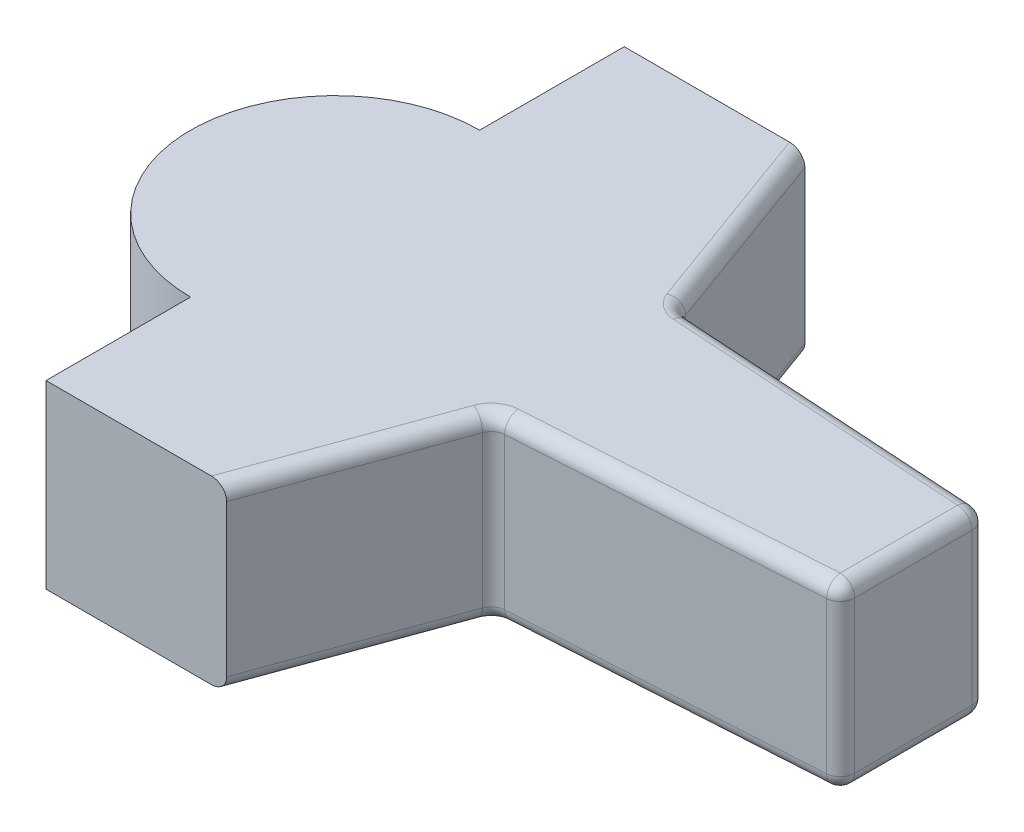
ISO-10303-21;
HEADER;
FILE_DESCRIPTION(('STEP AP214'),'2;1');
FILE_NAME('part.step','',(''),(''),'','','');
FILE_SCHEMA(('AUTOMOTIVE_DESIGN { 1 0 10303 214 1 1 1 1 }'));
ENDSEC;
DATA;
#1=APPLICATION_CONTEXT('core data for automotive mechanical design processes');
#2=APPLICATION_PROTOCOL_DEFINITION('international standard','automotive_design',2000,#1);
#3=PRODUCT_CONTEXT('',#1,'mechanical');
#4=PRODUCT('Part','Part','',(#3));
#5=PRODUCT_RELATED_PRODUCT_CATEGORY('part','',(#4));
#6=PRODUCT_DEFINITION_FORMATION('','',#4);
#7=PRODUCT_DEFINITION_CONTEXT('part definition',#1,'design');
#8=PRODUCT_DEFINITION('design','',#6,#7);
#9=PRODUCT_DEFINITION_SHAPE('','',#8);
#10=(LENGTH_UNIT() NAMED_UNIT(*) SI_UNIT(.MILLI.,.METRE.));
#11=(NAMED_UNIT(*) PLANE_ANGLE_UNIT() SI_UNIT($,.RADIAN.));
#12=(NAMED_UNIT(*) SI_UNIT($,.STERADIAN.) SOLID_ANGLE_UNIT());
#13=UNCERTAINTY_MEASURE_WITH_UNIT(LENGTH_MEASURE(1.E-05),#10,'distance_accuracy_value','');
#14=(GEOMETRIC_REPRESENTATION_CONTEXT(3) GLOBAL_UNCERTAINTY_ASSIGNED_CONTEXT((#13)) GLOBAL_UNIT_ASSIGNED_CONTEXT((#10,
#11,#12)) REPRESENTATION_CONTEXT('',''));
#15=CARTESIAN_POINT('',(0.,0.,0.));
#16=DIRECTION('',(0.,0.,1.));
#17=DIRECTION('',(1.,0.,0.));
#18=AXIS2_PLACEMENT_3D('',#15,#16,#17);
#19=CARTESIAN_POINT('',(0.,6.25,0.));
#20=DIRECTION('',(0.,-1.,0.));
#21=DIRECTION('',(0.,0.,-1.));
#22=AXIS2_PLACEMENT_3D('',#19,#20,#21);
#23=CYLINDRICAL_SURFACE('',#22,10.);
#24=CARTESIAN_POINT('',(0.,6.25,0.));
#25=DIRECTION('',(0.,1.,0.));
#26=DIRECTION('',(0.,0.,1.));
#27=AXIS2_PLACEMENT_3D('',#24,#25,#26);
#28=CIRCLE('',#27,10.);
#29=CARTESIAN_POINT('',(0.,6.25,-10.));
#30=VERTEX_POINT('',#29);
#31=CARTESIAN_POINT('',(0.,6.25,10.));
#32=VERTEX_POINT('',#31);
#33=EDGE_CURVE('E250',#30,#32,#28,.T.);
#34=ORIENTED_EDGE('',*,*,#33,.F.);
#35=DIRECTION('',(0.,-1.,0.));
#36=VECTOR('',#35,1.);
#37=CARTESIAN_POINT('',(0.,6.25,-10.));
#38=LINE('',#37,#36);
#39=CARTESIAN_POINT('',(0.,-6.25,-10.));
#40=VERTEX_POINT('',#39);
#41=EDGE_CURVE('E248',#30,#40,#38,.T.);
#42=ORIENTED_EDGE('',*,*,#41,.T.);
#43=CARTESIAN_POINT('',(0.,-6.25,0.));
#44=DIRECTION('',(0.,1.,0.));
#45=DIRECTION('',(0.,0.,1.));
#46=AXIS2_PLACEMENT_3D('',#43,#44,#45);
#47=CIRCLE('',#46,10.);
#48=CARTESIAN_POINT('',(0.,-6.25,10.));
#49=VERTEX_POINT('',#48);
#50=EDGE_CURVE('E225',#40,#49,#47,.T.);
#51=ORIENTED_EDGE('',*,*,#50,.T.);
#52=DIRECTION('',(0.,-1.,0.));
#53=VECTOR('',#52,1.);
#54=CARTESIAN_POINT('',(0.,6.25,10.));
#55=LINE('',#54,#53);
#56=EDGE_CURVE('E241',#49,#32,#55,.F.);
#57=ORIENTED_EDGE('',*,*,#56,.T.);
#58=EDGE_LOOP('',(#34,#42,#51,#57));
#59=FACE_BOUND('',#58,.T.);
#60=ADVANCED_FACE('F45',(#59),#23,.T.);
#61=CARTESIAN_POINT('',(0.,6.25,0.));
#62=DIRECTION('',(0.,1.,0.));
#63=DIRECTION('',(0.,0.,1.));
#64=AXIS2_PLACEMENT_3D('',#61,#62,#63);
#65=PLANE('',#64);
#66=DIRECTION('',(1.,0.,0.));
#67=VECTOR('',#66,1.);
#68=CARTESIAN_POINT('',(12.5,6.25,20.));
#69=LINE('',#68,#67);
#70=CARTESIAN_POINT('',(0.,6.25,20.));
#71=VERTEX_POINT('',#70);
#72=CARTESIAN_POINT('',(11.4358222275241,6.25,20.));
#73=VERTEX_POINT('',#72);
#74=EDGE_CURVE('E210',#71,#73,#69,.T.);
#75=ORIENTED_EDGE('',*,*,#74,.T.);
#76=DIRECTION('',(0.342020143325663,0.,-0.939692620785911));
#77=VECTOR('',#76,1.);
#78=CARTESIAN_POINT('',(16.5259612455731,6.25,6.01495798602529));
#79=LINE('',#78,#77);
#80=CARTESIAN_POINT('',(16.2828981983699,6.25,6.68276821971991));
#81=VERTEX_POINT('',#80);
#82=EDGE_CURVE('E343',#73,#81,#79,.T.);
#83=ORIENTED_EDGE('',*,*,#82,.T.);
#84=CARTESIAN_POINT('',(18.1622834399417,6.25,7.36680850637123));
#85=DIRECTION('',(0.,1.,0.));
#86=DIRECTION('',(0.,0.,1.));
#87=AXIS2_PLACEMENT_3D('',#84,#85,#86);
#88=CIRCLE('',#87,2.);
#89=CARTESIAN_POINT('',(18.0375268676313,6.25,5.37070334940546));
#90=VERTEX_POINT('',#89);
#91=EDGE_CURVE('E69',#81,#90,#88,.F.);
#92=ORIENTED_EDGE('',*,*,#91,.T.);
#93=DIRECTION('',(0.998052578482889,0.,-0.0623782861551805));
#94=VECTOR('',#93,1.);
#95=CARTESIAN_POINT('',(39.,6.25,4.06054877863241));
#96=LINE('',#95,#94);
#97=CARTESIAN_POINT('',(39.,6.25,4.06054877863241));
#98=VERTEX_POINT('',#97);
#99=EDGE_CURVE('E340',#90,#98,#96,.T.);
#100=ORIENTED_EDGE('',*,*,#99,.T.);
#101=DIRECTION('',(0.,0.,-1.));
#102=VECTOR('',#101,1.);
#103=CARTESIAN_POINT('',(39.,6.25,-4.06054877863241));
#104=LINE('',#103,#102);
#105=CARTESIAN_POINT('',(39.,6.25,-4.06054877863241));
#106=VERTEX_POINT('',#105);
#107=EDGE_CURVE('E338',#98,#106,#104,.T.);
#108=ORIENTED_EDGE('',*,*,#107,.T.);
#109=DIRECTION('',(-0.998052578482889,0.,-0.0623782861551805));
#110=VECTOR('',#109,1.);
#111=CARTESIAN_POINT('',(18.0375268676313,6.25,-5.37070334940546));
#112=LINE('',#111,#110);
#113=CARTESIAN_POINT('',(18.0375268676313,6.25,-5.37070334940546));
#114=VERTEX_POINT('',#113);
#115=EDGE_CURVE('E332',#106,#114,#112,.T.);
#116=ORIENTED_EDGE('',*,*,#115,.T.);
#117=CARTESIAN_POINT('',(18.1622834399417,6.25,-7.36680850637123));
#118=DIRECTION('',(0.,1.,0.));
#119=DIRECTION('',(0.,0.,1.));
#120=AXIS2_PLACEMENT_3D('',#117,#118,#119);
#121=CIRCLE('',#120,2.);
#122=CARTESIAN_POINT('',(16.2828981983699,6.25,-6.6827682197199));
#123=VERTEX_POINT('',#122);
#124=EDGE_CURVE('E334',#114,#123,#121,.F.);
#125=ORIENTED_EDGE('',*,*,#124,.T.);
#126=DIRECTION('',(-0.342020143325663,0.,-0.93969262078591));
#127=VECTOR('',#126,1.);
#128=CARTESIAN_POINT('',(16.5259612455731,6.25,-6.0149579860253));
#129=LINE('',#128,#127);
#130=CARTESIAN_POINT('',(11.4358222275241,6.25,-20.));
#131=VERTEX_POINT('',#130);
#132=EDGE_CURVE('E336',#123,#131,#129,.T.);
#133=ORIENTED_EDGE('',*,*,#132,.T.);
#134=DIRECTION('',(-1.,0.,0.));
#135=VECTOR('',#134,1.);
#136=CARTESIAN_POINT('',(0.,6.25,-20.));
#137=LINE('',#136,#135);
#138=CARTESIAN_POINT('',(0.,6.25,-20.));
#139=VERTEX_POINT('',#138);
#140=EDGE_CURVE('E231',#131,#139,#137,.T.);
#141=ORIENTED_EDGE('',*,*,#140,.T.);
#142=DIRECTION('',(0.,0.,1.));
#143=VECTOR('',#142,1.);
#144=CARTESIAN_POINT('',(0.,6.25,20.));
#145=LINE('',#144,#143);
#146=EDGE_CURVE('E217',#139,#30,#145,.T.);
#147=ORIENTED_EDGE('',*,*,#146,.T.);
#148=ORIENTED_EDGE('',*,*,#33,.T.);
#149=EDGE_CURVE('E233',#32,#71,#145,.T.);
#150=ORIENTED_EDGE('',*,*,#149,.T.);
#151=EDGE_LOOP('',(#75,#83,#92,#100,#108,#116,#125,#133,#141,#147,#148,#150));
#152=FACE_BOUND('',#151,.T.);
#153=ADVANCED_FACE('F399',(#152),#65,.T.);
#154=CARTESIAN_POINT('',(0.,-6.25,0.));
#155=DIRECTION('',(0.,1.,0.));
#156=DIRECTION('',(0.,0.,1.));
#157=AXIS2_PLACEMENT_3D('',#154,#155,#156);
#158=PLANE('',#157);
#159=CARTESIAN_POINT('',(18.1622834399417,-6.25,7.36680850637123));
#160=DIRECTION('',(0.,1.,0.));
#161=DIRECTION('',(0.,0.,1.));
#162=AXIS2_PLACEMENT_3D('',#159,#160,#161);
#163=CIRCLE('',#162,2.);
#164=CARTESIAN_POINT('',(18.0375268676313,-6.25,5.37070334940546));
#165=VERTEX_POINT('',#164);
#166=CARTESIAN_POINT('',(16.2828981983699,-6.25,6.68276821971991));
#167=VERTEX_POINT('',#166);
#168=EDGE_CURVE('E293',#165,#167,#163,.T.);
#169=ORIENTED_EDGE('',*,*,#168,.T.);
#170=DIRECTION('',(0.342020143325663,0.,-0.939692620785911));
#171=VECTOR('',#170,1.);
#172=CARTESIAN_POINT('',(11.5603073792141,-6.25,19.6579798566743));
#173=LINE('',#172,#171);
#174=CARTESIAN_POINT('',(11.4358222275241,-6.25,20.));
#175=VERTEX_POINT('',#174);
#176=EDGE_CURVE('E295',#167,#175,#173,.F.);
#177=ORIENTED_EDGE('',*,*,#176,.T.);
#178=DIRECTION('',(1.,0.,0.));
#179=VECTOR('',#178,1.);
#180=CARTESIAN_POINT('',(12.5,-6.25,20.));
#181=LINE('',#180,#179);
#182=CARTESIAN_POINT('',(0.,-6.25,20.));
#183=VERTEX_POINT('',#182);
#184=EDGE_CURVE('E226',#183,#175,#181,.T.);
#185=ORIENTED_EDGE('',*,*,#184,.F.);
#186=DIRECTION('',(0.,0.,1.));
#187=VECTOR('',#186,1.);
#188=CARTESIAN_POINT('',(0.,-6.25,20.));
#189=LINE('',#188,#187);
#190=EDGE_CURVE('E209',#49,#183,#189,.T.);
#191=ORIENTED_EDGE('',*,*,#190,.F.);
#192=ORIENTED_EDGE('',*,*,#50,.F.);
#193=CARTESIAN_POINT('',(0.,-6.25,-20.));
#194=VERTEX_POINT('',#193);
#195=EDGE_CURVE('E214',#194,#40,#189,.T.);
#196=ORIENTED_EDGE('',*,*,#195,.F.);
#197=DIRECTION('',(-1.,0.,0.));
#198=VECTOR('',#197,1.);
#199=CARTESIAN_POINT('',(0.,-6.25,-20.));
#200=LINE('',#199,#198);
#201=CARTESIAN_POINT('',(11.4358222275241,-6.25,-20.));
#202=VERTEX_POINT('',#201);
#203=EDGE_CURVE('E197',#202,#194,#200,.T.);
#204=ORIENTED_EDGE('',*,*,#203,.F.);
#205=DIRECTION('',(-0.342020143325663,0.,-0.93969262078591));
#206=VECTOR('',#205,1.);
#207=CARTESIAN_POINT('',(16.2828981983699,-6.25,-6.6827682197199));
#208=LINE('',#207,#206);
#209=CARTESIAN_POINT('',(16.2828981983699,-6.25,-6.6827682197199));
#210=VERTEX_POINT('',#209);
#211=EDGE_CURVE('E287',#202,#210,#208,.F.);
#212=ORIENTED_EDGE('',*,*,#211,.T.);
#213=CARTESIAN_POINT('',(18.1622834399417,-6.25,-7.36680850637123));
#214=DIRECTION('',(0.,1.,0.));
#215=DIRECTION('',(0.,0.,1.));
#216=AXIS2_PLACEMENT_3D('',#213,#214,#215);
#217=CIRCLE('',#216,2.);
#218=CARTESIAN_POINT('',(18.0375268676313,-6.25,-5.37070334940546));
#219=VERTEX_POINT('',#218);
#220=EDGE_CURVE('E285',#210,#219,#217,.T.);
#221=ORIENTED_EDGE('',*,*,#220,.T.);
#222=DIRECTION('',(-0.998052578482889,0.,-0.0623782861551805));
#223=VECTOR('',#222,1.);
#224=CARTESIAN_POINT('',(0.40454778388373,-6.25,-6.47276454213968));
#225=LINE('',#224,#223);
#226=CARTESIAN_POINT('',(39.,-6.25,-4.06054877863241));
#227=VERTEX_POINT('',#226);
#228=EDGE_CURVE('E283',#219,#227,#225,.F.);
#229=ORIENTED_EDGE('',*,*,#228,.T.);
#230=DIRECTION('',(0.,0.,-1.));
#231=VECTOR('',#230,1.);
#232=CARTESIAN_POINT('',(39.,-6.25,0.));
#233=LINE('',#232,#231);
#234=CARTESIAN_POINT('',(39.,-6.25,4.06054877863241));
#235=VERTEX_POINT('',#234);
#236=EDGE_CURVE('E289',#227,#235,#233,.F.);
#237=ORIENTED_EDGE('',*,*,#236,.T.);
#238=DIRECTION('',(0.998052578482889,0.,-0.0623782861551805));
#239=VECTOR('',#238,1.);
#240=CARTESIAN_POINT('',(0.40454778388373,-6.25,6.47276454213968));
#241=LINE('',#240,#239);
#242=EDGE_CURVE('E291',#235,#165,#241,.F.);
#243=ORIENTED_EDGE('',*,*,#242,.T.);
#244=EDGE_LOOP('',(#169,#177,#185,#191,#192,#196,#204,#212,#221,#229,#237,#243));
#245=FACE_BOUND('',#244,.T.);
#246=ADVANCED_FACE('F222',(#245),#158,.F.);
#247=CARTESIAN_POINT('',(0.,6.25,7.5));
#248=DIRECTION('',(-0.0623782861551805,0.,-0.998052578482889));
#249=DIRECTION('',(-0.998052578482889,0.,0.0623782861551805));
#250=AXIS2_PLACEMENT_3D('',#247,#248,#249);
#251=PLANE('',#250);
#252=DIRECTION('',(0.,-1.,0.));
#253=VECTOR('',#252,1.);
#254=CARTESIAN_POINT('',(18.0999051537865,6.25,6.36875592788834));
#255=LINE('',#254,#253);
#256=CARTESIAN_POINT('',(18.0999051537865,5.25,6.36875592788834));
#257=VERTEX_POINT('',#256);
#258=CARTESIAN_POINT('',(18.0999051537865,-5.25,6.36875592788834));
#259=VERTEX_POINT('',#258);
#260=EDGE_CURVE('E257',#257,#259,#255,.T.);
#261=ORIENTED_EDGE('',*,*,#260,.T.);
#262=DIRECTION('',(0.998052578482889,0.,-0.0623782861551805));
#263=VECTOR('',#262,1.);
#264=CARTESIAN_POINT('',(0.,-5.25,7.5));
#265=LINE('',#264,#263);
#266=CARTESIAN_POINT('',(39.0623782861552,-5.25,5.0586013571153));
#267=VERTEX_POINT('',#266);
#268=EDGE_CURVE('E307',#259,#267,#265,.T.);
#269=ORIENTED_EDGE('',*,*,#268,.T.);
#270=DIRECTION('',(0.,-1.,0.));
#271=VECTOR('',#270,1.);
#272=CARTESIAN_POINT('',(39.0623782861552,6.25,5.0586013571153));
#273=LINE('',#272,#271);
#274=CARTESIAN_POINT('',(39.0623782861552,5.25,5.0586013571153));
#275=VERTEX_POINT('',#274);
#276=EDGE_CURVE('E253',#267,#275,#273,.F.);
#277=ORIENTED_EDGE('',*,*,#276,.T.);
#278=DIRECTION('',(0.998052578482889,0.,-0.0623782861551805));
#279=VECTOR('',#278,1.);
#280=CARTESIAN_POINT('',(18.0999051537865,5.25,6.36875592788834));
#281=LINE('',#280,#279);
#282=EDGE_CURVE('E305',#275,#257,#281,.F.);
#283=ORIENTED_EDGE('',*,*,#282,.T.);
#284=EDGE_LOOP('',(#261,#269,#277,#283));
#285=FACE_BOUND('',#284,.T.);
#286=ADVANCED_FACE('F653',(#285),#251,.F.);
#287=CARTESIAN_POINT('',(40.,6.25,-5.));
#288=DIRECTION('',(-0.0623782861551805,0.,0.998052578482889));
#289=DIRECTION('',(0.998052578482889,0.,0.0623782861551805));
#290=AXIS2_PLACEMENT_3D('',#287,#288,#289);
#291=PLANE('',#290);
#292=DIRECTION('',(0.,-1.,0.));
#293=VECTOR('',#292,1.);
#294=CARTESIAN_POINT('',(39.0623782861552,6.25,-5.0586013571153));
#295=LINE('',#294,#293);
#296=CARTESIAN_POINT('',(39.0623782861552,5.25,-5.0586013571153));
#297=VERTEX_POINT('',#296);
#298=CARTESIAN_POINT('',(39.0623782861552,-5.25,-5.0586013571153));
#299=VERTEX_POINT('',#298);
#300=EDGE_CURVE('E263',#297,#299,#295,.T.);
#301=ORIENTED_EDGE('',*,*,#300,.T.);
#302=DIRECTION('',(-0.998052578482889,0.,-0.0623782861551805));
#303=VECTOR('',#302,1.);
#304=CARTESIAN_POINT('',(40.,-5.25,-5.));
#305=LINE('',#304,#303);
#306=CARTESIAN_POINT('',(18.0999051537865,-5.25,-6.36875592788834));
#307=VERTEX_POINT('',#306);
#308=EDGE_CURVE('E11',#299,#307,#305,.T.);
#309=ORIENTED_EDGE('',*,*,#308,.T.);
#310=DIRECTION('',(0.,1.,0.));
#311=VECTOR('',#310,1.);
#312=CARTESIAN_POINT('',(18.0999051537865,6.25,-6.36875592788834));
#313=LINE('',#312,#311);
#314=CARTESIAN_POINT('',(18.0999051537865,5.25,-6.36875592788834));
#315=VERTEX_POINT('',#314);
#316=EDGE_CURVE('E266',#307,#315,#313,.T.);
#317=ORIENTED_EDGE('',*,*,#316,.T.);
#318=DIRECTION('',(-0.998052578482889,0.,-0.0623782861551805));
#319=VECTOR('',#318,1.);
#320=CARTESIAN_POINT('',(39.0623782861552,5.25,-5.0586013571153));
#321=LINE('',#320,#319);
#322=EDGE_CURVE('E54',#315,#297,#321,.F.);
#323=ORIENTED_EDGE('',*,*,#322,.T.);
#324=EDGE_LOOP('',(#301,#309,#317,#323));
#325=FACE_BOUND('',#324,.T.);
#326=ADVANCED_FACE('F643',(#325),#291,.F.);
#327=CARTESIAN_POINT('',(40.,6.25,5.));
#328=DIRECTION('',(-1.,0.,0.));
#329=DIRECTION('',(0.,0.,1.));
#330=AXIS2_PLACEMENT_3D('',#327,#328,#329);
#331=PLANE('',#330);
#332=DIRECTION('',(0.,-1.,0.));
#333=VECTOR('',#332,1.);
#334=CARTESIAN_POINT('',(40.,6.25,4.06054877863241));
#335=LINE('',#334,#333);
#336=CARTESIAN_POINT('',(40.,5.25,4.06054877863241));
#337=VERTEX_POINT('',#336);
#338=CARTESIAN_POINT('',(40.,-5.25,4.06054877863241));
#339=VERTEX_POINT('',#338);
#340=EDGE_CURVE('E272',#337,#339,#335,.T.);
#341=ORIENTED_EDGE('',*,*,#340,.T.);
#342=DIRECTION('',(0.,0.,-1.));
#343=VECTOR('',#342,1.);
#344=CARTESIAN_POINT('',(40.,-5.25,5.));
#345=LINE('',#344,#343);
#346=CARTESIAN_POINT('',(40.,-5.25,-4.06054877863241));
#347=VERTEX_POINT('',#346);
#348=EDGE_CURVE('E315',#339,#347,#345,.T.);
#349=ORIENTED_EDGE('',*,*,#348,.T.);
#350=DIRECTION('',(0.,-1.,0.));
#351=VECTOR('',#350,1.);
#352=CARTESIAN_POINT('',(40.,6.25,-4.06054877863241));
#353=LINE('',#352,#351);
#354=CARTESIAN_POINT('',(40.,5.25,-4.06054877863241));
#355=VERTEX_POINT('',#354);
#356=EDGE_CURVE('E275',#347,#355,#353,.F.);
#357=ORIENTED_EDGE('',*,*,#356,.T.);
#358=DIRECTION('',(0.,0.,-1.));
#359=VECTOR('',#358,1.);
#360=CARTESIAN_POINT('',(40.,5.25,4.06054877863241));
#361=LINE('',#360,#359);
#362=EDGE_CURVE('E313',#355,#337,#361,.F.);
#363=ORIENTED_EDGE('',*,*,#362,.T.);
#364=EDGE_LOOP('',(#341,#349,#357,#363));
#365=FACE_BOUND('',#364,.T.);
#366=ADVANCED_FACE('F635',(#365),#331,.F.);
#367=CARTESIAN_POINT('',(0.,-6.25,-20.));
#368=DIRECTION('',(0.,0.,-1.));
#369=DIRECTION('',(-1.,0.,0.));
#370=AXIS2_PLACEMENT_3D('',#367,#368,#369);
#371=PLANE('',#370);
#372=DIRECTION('',(0.,1.,0.));
#373=VECTOR('',#372,1.);
#374=CARTESIAN_POINT('',(12.5,-6.25,-20.));
#375=LINE('',#374,#373);
#376=CARTESIAN_POINT('',(12.5,-5.25,-20.));
#377=VERTEX_POINT('',#376);
#378=CARTESIAN_POINT('',(12.5,5.25,-20.));
#379=VERTEX_POINT('',#378);
#380=EDGE_CURVE('E219',#377,#379,#375,.T.);
#381=ORIENTED_EDGE('',*,*,#380,.F.);
#382=CARTESIAN_POINT('',(11.4358222275241,-5.25,-20.));
#383=DIRECTION('',(0.,0.,-1.));
#384=DIRECTION('',(1.,0.,0.));
#385=AXIS2_PLACEMENT_3D('',#382,#383,#384);
#386=ELLIPSE('',#385,1.06417777247591,1.);
#387=EDGE_CURVE('E205',#377,#202,#386,.T.);
#388=ORIENTED_EDGE('',*,*,#387,.T.);
#389=ORIENTED_EDGE('',*,*,#203,.T.);
#390=DIRECTION('',(0.,1.,0.));
#391=VECTOR('',#390,1.);
#392=CARTESIAN_POINT('',(0.,-6.25,-20.));
#393=LINE('',#392,#391);
#394=EDGE_CURVE('E202',#194,#139,#393,.T.);
#395=ORIENTED_EDGE('',*,*,#394,.T.);
#396=ORIENTED_EDGE('',*,*,#140,.F.);
#397=CARTESIAN_POINT('',(11.4358222275241,5.25,-20.));
#398=DIRECTION('',(0.,0.,-1.));
#399=DIRECTION('',(-1.,0.,0.));
#400=AXIS2_PLACEMENT_3D('',#397,#398,#399);
#401=ELLIPSE('',#400,1.06417777247591,1.);
#402=EDGE_CURVE('E325',#131,#379,#401,.T.);
#403=ORIENTED_EDGE('',*,*,#402,.T.);
#404=EDGE_LOOP('',(#381,#388,#389,#395,#396,#403));
#405=FACE_BOUND('',#404,.T.);
#406=ADVANCED_FACE('F200',(#405),#371,.T.);
#407=CARTESIAN_POINT('',(12.5,-6.25,-20.));
#408=DIRECTION('',(0.93969262078591,0.,-0.342020143325663));
#409=DIRECTION('',(-0.342020143325663,0.,-0.93969262078591));
#410=AXIS2_PLACEMENT_3D('',#407,#408,#409);
#411=PLANE('',#410);
#412=DIRECTION('',(0.,1.,0.));
#413=VECTOR('',#412,1.);
#414=CARTESIAN_POINT('',(17.2225908191558,-6.25,-7.02478836304556));
#415=LINE('',#414,#413);
#416=CARTESIAN_POINT('',(17.2225908191558,5.25,-7.02478836304556));
#417=VERTEX_POINT('',#416);
#418=CARTESIAN_POINT('',(17.2225908191558,-5.25,-7.02478836304556));
#419=VERTEX_POINT('',#418);
#420=EDGE_CURVE('E269',#417,#419,#415,.F.);
#421=ORIENTED_EDGE('',*,*,#420,.T.);
#422=DIRECTION('',(-0.342020143325663,0.,-0.93969262078591));
#423=VECTOR('',#422,1.);
#424=CARTESIAN_POINT('',(12.5,-5.25,-20.));
#425=LINE('',#424,#423);
#426=EDGE_CURVE('E323',#419,#377,#425,.T.);
#427=ORIENTED_EDGE('',*,*,#426,.T.);
#428=ORIENTED_EDGE('',*,*,#380,.T.);
#429=DIRECTION('',(-0.342020143325663,0.,-0.93969262078591));
#430=VECTOR('',#429,1.);
#431=CARTESIAN_POINT('',(12.5,5.25,-20.));
#432=LINE('',#431,#430);
#433=EDGE_CURVE('E321',#379,#417,#432,.F.);
#434=ORIENTED_EDGE('',*,*,#433,.T.);
#435=EDGE_LOOP('',(#421,#427,#428,#434));
#436=FACE_BOUND('',#435,.T.);
#437=ADVANCED_FACE('F401',(#436),#411,.T.);
#438=CARTESIAN_POINT('',(0.,-6.25,20.));
#439=DIRECTION('',(-1.,0.,0.));
#440=DIRECTION('',(0.,0.,1.));
#441=AXIS2_PLACEMENT_3D('',#438,#439,#440);
#442=PLANE('',#441);
#443=ORIENTED_EDGE('',*,*,#41,.F.);
#444=ORIENTED_EDGE('',*,*,#146,.F.);
#445=ORIENTED_EDGE('',*,*,#394,.F.);
#446=ORIENTED_EDGE('',*,*,#195,.T.);
#447=EDGE_LOOP('',(#443,#444,#445,#446));
#448=FACE_BOUND('',#447,.T.);
#449=ADVANCED_FACE('F213',(#448),#442,.T.);
#450=ORIENTED_EDGE('',*,*,#56,.F.);
#451=ORIENTED_EDGE('',*,*,#190,.T.);
#452=DIRECTION('',(0.,1.,0.));
#453=VECTOR('',#452,1.);
#454=CARTESIAN_POINT('',(0.,-6.25,20.));
#455=LINE('',#454,#453);
#456=EDGE_CURVE('E218',#183,#71,#455,.T.);
#457=ORIENTED_EDGE('',*,*,#456,.T.);
#458=ORIENTED_EDGE('',*,*,#149,.F.);
#459=EDGE_LOOP('',(#450,#451,#457,#458));
#460=FACE_BOUND('',#459,.T.);
#461=ADVANCED_FACE('F466',(#460),#442,.T.);
#462=CARTESIAN_POINT('',(19.7794046853239,-6.25,0.));
#463=DIRECTION('',(0.93969262078591,0.,0.342020143325663));
#464=DIRECTION('',(0.342020143325663,0.,-0.939692620785911));
#465=AXIS2_PLACEMENT_3D('',#462,#463,#464);
#466=PLANE('',#465);
#467=DIRECTION('',(0.,1.,0.));
#468=VECTOR('',#467,1.);
#469=CARTESIAN_POINT('',(12.5,-6.25,20.));
#470=LINE('',#469,#468);
#471=CARTESIAN_POINT('',(12.5,-5.25,20.));
#472=VERTEX_POINT('',#471);
#473=CARTESIAN_POINT('',(12.5,5.25,20.));
#474=VERTEX_POINT('',#473);
#475=EDGE_CURVE('E238',#472,#474,#470,.T.);
#476=ORIENTED_EDGE('',*,*,#475,.F.);
#477=DIRECTION('',(0.342020143325663,0.,-0.939692620785911));
#478=VECTOR('',#477,1.);
#479=CARTESIAN_POINT('',(17.2225908191558,-5.25,7.02478836304557));
#480=LINE('',#479,#478);
#481=CARTESIAN_POINT('',(17.2225908191558,-5.25,7.02478836304557));
#482=VERTEX_POINT('',#481);
#483=EDGE_CURVE('E280',#472,#482,#480,.T.);
#484=ORIENTED_EDGE('',*,*,#483,.T.);
#485=DIRECTION('',(0.,-1.,0.));
#486=VECTOR('',#485,1.);
#487=CARTESIAN_POINT('',(17.2225908191558,-6.25,7.02478836304557));
#488=LINE('',#487,#486);
#489=CARTESIAN_POINT('',(17.2225908191558,5.25,7.02478836304557));
#490=VERTEX_POINT('',#489);
#491=EDGE_CURVE('E260',#482,#490,#488,.F.);
#492=ORIENTED_EDGE('',*,*,#491,.T.);
#493=DIRECTION('',(0.342020143325663,0.,-0.939692620785911));
#494=VECTOR('',#493,1.);
#495=CARTESIAN_POINT('',(19.7794046853239,5.25,0.));
#496=LINE('',#495,#494);
#497=EDGE_CURVE('E278',#490,#474,#496,.F.);
#498=ORIENTED_EDGE('',*,*,#497,.T.);
#499=EDGE_LOOP('',(#476,#484,#492,#498));
#500=FACE_BOUND('',#499,.T.);
#501=ADVANCED_FACE('F451',(#500),#466,.T.);
#502=CARTESIAN_POINT('',(12.5,-6.25,20.));
#503=DIRECTION('',(0.,0.,1.));
#504=DIRECTION('',(1.,0.,0.));
#505=AXIS2_PLACEMENT_3D('',#502,#503,#504);
#506=PLANE('',#505);
#507=ORIENTED_EDGE('',*,*,#184,.T.);
#508=CARTESIAN_POINT('',(11.4358222275241,-5.25,20.));
#509=DIRECTION('',(0.,0.,1.));
#510=DIRECTION('',(-1.,0.,0.));
#511=AXIS2_PLACEMENT_3D('',#508,#509,#510);
#512=ELLIPSE('',#511,1.06417777247591,1.);
#513=EDGE_CURVE('E299',#175,#472,#512,.T.);
#514=ORIENTED_EDGE('',*,*,#513,.T.);
#515=ORIENTED_EDGE('',*,*,#475,.T.);
#516=CARTESIAN_POINT('',(11.4358222275241,5.25,20.));
#517=DIRECTION('',(0.,0.,1.));
#518=DIRECTION('',(1.,0.,0.));
#519=AXIS2_PLACEMENT_3D('',#516,#517,#518);
#520=ELLIPSE('',#519,1.06417777247591,1.);
#521=EDGE_CURVE('E297',#474,#73,#520,.T.);
#522=ORIENTED_EDGE('',*,*,#521,.T.);
#523=ORIENTED_EDGE('',*,*,#74,.F.);
#524=ORIENTED_EDGE('',*,*,#456,.F.);
#525=EDGE_LOOP('',(#507,#514,#515,#522,#523,#524));
#526=FACE_BOUND('',#525,.T.);
#527=ADVANCED_FACE('F461',(#526),#506,.T.);
#528=CARTESIAN_POINT('',(18.1622834399417,6.25,7.36680850637123));
#529=DIRECTION('',(0.,-1.,0.));
#530=DIRECTION('',(0.,0.,-1.));
#531=AXIS2_PLACEMENT_3D('',#528,#529,#530);
#532=CYLINDRICAL_SURFACE('',#531,1.);
#533=ORIENTED_EDGE('',*,*,#491,.F.);
#534=CARTESIAN_POINT('',(18.1622834399417,-5.25,7.36680850637123));
#535=DIRECTION('',(0.,1.,0.));
#536=DIRECTION('',(0.,0.,1.));
#537=AXIS2_PLACEMENT_3D('',#534,#535,#536);
#538=CIRCLE('',#537,1.);
#539=EDGE_CURVE('E303',#482,#259,#538,.F.);
#540=ORIENTED_EDGE('',*,*,#539,.T.);
#541=ORIENTED_EDGE('',*,*,#260,.F.);
#542=CARTESIAN_POINT('',(18.1622834399417,5.25,7.36680850637123));
#543=DIRECTION('',(0.,1.,0.));
#544=DIRECTION('',(0.,0.,1.));
#545=AXIS2_PLACEMENT_3D('',#542,#543,#544);
#546=CIRCLE('',#545,1.);
#547=EDGE_CURVE('E301',#257,#490,#546,.T.);
#548=ORIENTED_EDGE('',*,*,#547,.T.);
#549=EDGE_LOOP('',(#533,#540,#541,#548));
#550=FACE_BOUND('',#549,.T.);
#551=ADVANCED_FACE('F452',(#550),#532,.F.);
#552=CARTESIAN_POINT('',(18.1622834399417,6.25,-7.36680850637123));
#553=DIRECTION('',(0.,1.,0.));
#554=DIRECTION('',(0.,0.,1.));
#555=AXIS2_PLACEMENT_3D('',#552,#553,#554);
#556=CYLINDRICAL_SURFACE('',#555,1.);
#557=ORIENTED_EDGE('',*,*,#316,.F.);
#558=CARTESIAN_POINT('',(18.1622834399417,-5.25,-7.36680850637123));
#559=DIRECTION('',(0.,1.,0.));
#560=DIRECTION('',(0.,0.,1.));
#561=AXIS2_PLACEMENT_3D('',#558,#559,#560);
#562=CIRCLE('',#561,1.);
#563=EDGE_CURVE('E330',#307,#419,#562,.F.);
#564=ORIENTED_EDGE('',*,*,#563,.T.);
#565=ORIENTED_EDGE('',*,*,#420,.F.);
#566=CARTESIAN_POINT('',(18.1622834399417,5.25,-7.36680850637123));
#567=DIRECTION('',(0.,1.,0.));
#568=DIRECTION('',(0.,0.,1.));
#569=AXIS2_PLACEMENT_3D('',#566,#567,#568);
#570=CIRCLE('',#569,1.);
#571=EDGE_CURVE('E328',#417,#315,#570,.T.);
#572=ORIENTED_EDGE('',*,*,#571,.T.);
#573=EDGE_LOOP('',(#557,#564,#565,#572));
#574=FACE_BOUND('',#573,.T.);
#575=ADVANCED_FACE('F486',(#574),#556,.F.);
#576=CARTESIAN_POINT('',(39.,6.25,-4.06054877863241));
#577=DIRECTION('',(0.,-1.,0.));
#578=DIRECTION('',(0.,0.,-1.));
#579=AXIS2_PLACEMENT_3D('',#576,#577,#578);
#580=CYLINDRICAL_SURFACE('',#579,1.);
#581=ORIENTED_EDGE('',*,*,#356,.F.);
#582=CARTESIAN_POINT('',(39.,-5.25,-4.06054877863241));
#583=DIRECTION('',(0.,-1.,0.));
#584=DIRECTION('',(0.,0.,-1.));
#585=AXIS2_PLACEMENT_3D('',#582,#583,#584);
#586=CIRCLE('',#585,1.);
#587=EDGE_CURVE('E319',#347,#299,#586,.F.);
#588=ORIENTED_EDGE('',*,*,#587,.T.);
#589=ORIENTED_EDGE('',*,*,#300,.F.);
#590=CARTESIAN_POINT('',(39.,5.25,-4.06054877863241));
#591=DIRECTION('',(0.,-1.,0.));
#592=DIRECTION('',(0.,0.,-1.));
#593=AXIS2_PLACEMENT_3D('',#590,#591,#592);
#594=CIRCLE('',#593,1.);
#595=EDGE_CURVE('E317',#297,#355,#594,.T.);
#596=ORIENTED_EDGE('',*,*,#595,.T.);
#597=EDGE_LOOP('',(#581,#588,#589,#596));
#598=FACE_BOUND('',#597,.T.);
#599=ADVANCED_FACE('F489',(#598),#580,.T.);
#600=CARTESIAN_POINT('',(39.,6.25,4.06054877863241));
#601=DIRECTION('',(0.,-1.,0.));
#602=DIRECTION('',(0.,0.,-1.));
#603=AXIS2_PLACEMENT_3D('',#600,#601,#602);
#604=CYLINDRICAL_SURFACE('',#603,1.);
#605=ORIENTED_EDGE('',*,*,#276,.F.);
#606=CARTESIAN_POINT('',(39.,-5.25,4.06054877863241));
#607=DIRECTION('',(0.,-1.,0.));
#608=DIRECTION('',(0.,0.,-1.));
#609=AXIS2_PLACEMENT_3D('',#606,#607,#608);
#610=CIRCLE('',#609,1.);
#611=EDGE_CURVE('E311',#267,#339,#610,.F.);
#612=ORIENTED_EDGE('',*,*,#611,.T.);
#613=ORIENTED_EDGE('',*,*,#340,.F.);
#614=CARTESIAN_POINT('',(39.,5.25,4.06054877863241));
#615=DIRECTION('',(0.,-1.,0.));
#616=DIRECTION('',(0.,0.,-1.));
#617=AXIS2_PLACEMENT_3D('',#614,#615,#616);
#618=CIRCLE('',#617,1.);
#619=EDGE_CURVE('E309',#337,#275,#618,.T.);
#620=ORIENTED_EDGE('',*,*,#619,.T.);
#621=EDGE_LOOP('',(#605,#612,#613,#620));
#622=FACE_BOUND('',#621,.T.);
#623=ADVANCED_FACE('F493',(#622),#604,.T.);
#624=CARTESIAN_POINT('',(11.5603073792141,-5.25,-19.6579798566743));
#625=DIRECTION('',(0.342020143325663,0.,0.93969262078591));
#626=DIRECTION('',(0.93969262078591,0.,-0.342020143325663));
#627=AXIS2_PLACEMENT_3D('',#624,#625,#626);
#628=CYLINDRICAL_SURFACE('',#627,1.);
#629=ORIENTED_EDGE('',*,*,#387,.F.);
#630=ORIENTED_EDGE('',*,*,#426,.F.);
#631=CARTESIAN_POINT('',(16.2828981983699,-5.25,-6.6827682197199));
#632=DIRECTION('',(0.342020143325663,0.,0.93969262078591));
#633=DIRECTION('',(0.939692620785911,0.,-0.342020143325663));
#634=AXIS2_PLACEMENT_3D('',#631,#632,#633);
#635=CIRCLE('',#634,1.);
#636=EDGE_CURVE('E234',#210,#419,#635,.T.);
#637=ORIENTED_EDGE('',*,*,#636,.F.);
#638=ORIENTED_EDGE('',*,*,#211,.F.);
#639=EDGE_LOOP('',(#629,#630,#637,#638));
#640=FACE_BOUND('',#639,.T.);
#641=ADVANCED_FACE('F406',(#640),#628,.T.);
#642=CARTESIAN_POINT('',(18.1622834399417,-5.25,-7.36680850637123));
#643=DIRECTION('',(0.,1.,0.));
#644=DIRECTION('',(0.,0.,1.));
#645=AXIS2_PLACEMENT_3D('',#642,#643,#644);
#646=TOROIDAL_SURFACE('',#645,2.,1.);
#647=ORIENTED_EDGE('',*,*,#636,.T.);
#648=ORIENTED_EDGE('',*,*,#563,.F.);
#649=CARTESIAN_POINT('',(18.0375268676313,-5.25,-5.37070334940546));
#650=DIRECTION('',(0.998052578482889,0.,0.0623782861551812));
#651=DIRECTION('',(0.0623782861551812,0.,-0.998052578482889));
#652=AXIS2_PLACEMENT_3D('',#649,#650,#651);
#653=CIRCLE('',#652,1.);
#654=EDGE_CURVE('E363',#219,#307,#653,.T.);
#655=ORIENTED_EDGE('',*,*,#654,.F.);
#656=ORIENTED_EDGE('',*,*,#220,.F.);
#657=EDGE_LOOP('',(#647,#648,#655,#656));
#658=FACE_BOUND('',#657,.T.);
#659=ADVANCED_FACE('F410',(#658),#646,.T.);
#660=CARTESIAN_POINT('',(39.9376217138448,-5.25,-4.00194742151711));
#661=DIRECTION('',(-0.998052578482889,0.,-0.0623782861551805));
#662=DIRECTION('',(-0.0623782861551805,0.,0.998052578482889));
#663=AXIS2_PLACEMENT_3D('',#660,#661,#662);
#664=CYLINDRICAL_SURFACE('',#663,1.);
#665=ORIENTED_EDGE('',*,*,#654,.T.);
#666=ORIENTED_EDGE('',*,*,#308,.F.);
#667=CARTESIAN_POINT('',(39.,-5.25,-4.06054877863241));
#668=DIRECTION('',(0.998052578482889,0.,0.0623782861551778));
#669=DIRECTION('',(0.0623782861551778,0.,-0.998052578482889));
#670=AXIS2_PLACEMENT_3D('',#667,#668,#669);
#671=CIRCLE('',#670,1.);
#672=EDGE_CURVE('E360',#227,#299,#671,.T.);
#673=ORIENTED_EDGE('',*,*,#672,.F.);
#674=ORIENTED_EDGE('',*,*,#228,.F.);
#675=EDGE_LOOP('',(#665,#666,#673,#674));
#676=FACE_BOUND('',#675,.T.);
#677=ADVANCED_FACE('F419',(#676),#664,.T.);
#678=CARTESIAN_POINT('',(39.,-5.25,-4.06054877863241));
#679=DIRECTION('',(0.,1.,0.));
#680=DIRECTION('',(0.,0.,1.));
#681=AXIS2_PLACEMENT_3D('',#678,#679,#680);
#682=SPHERICAL_SURFACE('',#681,1.);
#683=ORIENTED_EDGE('',*,*,#672,.T.);
#684=ORIENTED_EDGE('',*,*,#587,.F.);
#685=CARTESIAN_POINT('',(39.,-5.25,-4.06054877863241));
#686=DIRECTION('',(0.,0.,1.));
#687=DIRECTION('',(1.,0.,0.));
#688=AXIS2_PLACEMENT_3D('',#685,#686,#687);
#689=CIRCLE('',#688,1.);
#690=EDGE_CURVE('E357',#227,#347,#689,.T.);
#691=ORIENTED_EDGE('',*,*,#690,.F.);
#692=EDGE_LOOP('',(#683,#684,#691));
#693=FACE_BOUND('',#692,.T.);
#694=ADVANCED_FACE('F422',(#693),#682,.T.);
#695=CARTESIAN_POINT('',(39.,-5.25,5.));
#696=DIRECTION('',(0.,0.,-1.));
#697=DIRECTION('',(-1.,0.,0.));
#698=AXIS2_PLACEMENT_3D('',#695,#696,#697);
#699=CYLINDRICAL_SURFACE('',#698,1.);
#700=ORIENTED_EDGE('',*,*,#690,.T.);
#701=ORIENTED_EDGE('',*,*,#348,.F.);
#702=CARTESIAN_POINT('',(39.,-5.25,4.06054877863241));
#703=DIRECTION('',(0.,0.,1.));
#704=DIRECTION('',(1.,0.,0.));
#705=AXIS2_PLACEMENT_3D('',#702,#703,#704);
#706=CIRCLE('',#705,1.);
#707=EDGE_CURVE('E354',#235,#339,#706,.T.);
#708=ORIENTED_EDGE('',*,*,#707,.F.);
#709=ORIENTED_EDGE('',*,*,#236,.F.);
#710=EDGE_LOOP('',(#700,#701,#708,#709));
#711=FACE_BOUND('',#710,.T.);
#712=ADVANCED_FACE('F425',(#711),#699,.T.);
#713=CARTESIAN_POINT('',(39.,-5.25,4.06054877863241));
#714=DIRECTION('',(0.,1.,0.));
#715=DIRECTION('',(0.,0.,1.));
#716=AXIS2_PLACEMENT_3D('',#713,#714,#715);
#717=SPHERICAL_SURFACE('',#716,1.);
#718=ORIENTED_EDGE('',*,*,#707,.T.);
#719=ORIENTED_EDGE('',*,*,#611,.F.);
#720=CARTESIAN_POINT('',(39.,-5.25,4.06054877863241));
#721=DIRECTION('',(-0.998052578482888,0.,0.0623782861551847));
#722=DIRECTION('',(0.0623782861551847,0.,0.998052578482888));
#723=AXIS2_PLACEMENT_3D('',#720,#721,#722);
#724=CIRCLE('',#723,1.);
#725=EDGE_CURVE('E351',#235,#267,#724,.T.);
#726=ORIENTED_EDGE('',*,*,#725,.F.);
#727=EDGE_LOOP('',(#718,#719,#726));
#728=FACE_BOUND('',#727,.T.);
#729=ADVANCED_FACE('F430',(#728),#717,.T.);
#730=CARTESIAN_POINT('',(-0.0623782861551805,-5.25,6.50194742151711));
#731=DIRECTION('',(0.998052578482889,0.,-0.0623782861551805));
#732=DIRECTION('',(-0.0623782861551805,0.,-0.998052578482889));
#733=AXIS2_PLACEMENT_3D('',#730,#731,#732);
#734=CYLINDRICAL_SURFACE('',#733,1.);
#735=ORIENTED_EDGE('',*,*,#725,.T.);
#736=ORIENTED_EDGE('',*,*,#268,.F.);
#737=CARTESIAN_POINT('',(18.0375268676313,-5.25,5.37070334940546));
#738=DIRECTION('',(-0.998052578482889,0.,0.0623782861551812));
#739=DIRECTION('',(0.0623782861551812,0.,0.998052578482889));
#740=AXIS2_PLACEMENT_3D('',#737,#738,#739);
#741=CIRCLE('',#740,1.);
#742=EDGE_CURVE('E348',#165,#259,#741,.T.);
#743=ORIENTED_EDGE('',*,*,#742,.F.);
#744=ORIENTED_EDGE('',*,*,#242,.F.);
#745=EDGE_LOOP('',(#735,#736,#743,#744));
#746=FACE_BOUND('',#745,.T.);
#747=ADVANCED_FACE('F434',(#746),#734,.T.);
#748=CARTESIAN_POINT('',(18.1622834399417,-5.25,7.36680850637123));
#749=DIRECTION('',(0.,1.,0.));
#750=DIRECTION('',(0.,0.,1.));
#751=AXIS2_PLACEMENT_3D('',#748,#749,#750);
#752=TOROIDAL_SURFACE('',#751,2.,1.);
#753=ORIENTED_EDGE('',*,*,#742,.T.);
#754=ORIENTED_EDGE('',*,*,#539,.F.);
#755=CARTESIAN_POINT('',(16.2828981983699,-5.25,6.68276821971991));
#756=DIRECTION('',(-0.342020143325664,0.,0.93969262078591));
#757=DIRECTION('',(0.93969262078591,0.,0.342020143325664));
#758=AXIS2_PLACEMENT_3D('',#755,#756,#757);
#759=CIRCLE('',#758,1.);
#760=EDGE_CURVE('E346',#167,#482,#759,.T.);
#761=ORIENTED_EDGE('',*,*,#760,.F.);
#762=ORIENTED_EDGE('',*,*,#168,.F.);
#763=EDGE_LOOP('',(#753,#754,#761,#762));
#764=FACE_BOUND('',#763,.T.);
#765=ADVANCED_FACE('F445',(#764),#752,.T.);
#766=CARTESIAN_POINT('',(18.839712064538,-5.25,-0.342020143325663));
#767=DIRECTION('',(-0.342020143325663,0.,0.939692620785911));
#768=DIRECTION('',(0.93969262078591,0.,0.342020143325663));
#769=AXIS2_PLACEMENT_3D('',#766,#767,#768);
#770=CYLINDRICAL_SURFACE('',#769,1.);
#771=ORIENTED_EDGE('',*,*,#513,.F.);
#772=ORIENTED_EDGE('',*,*,#176,.F.);
#773=ORIENTED_EDGE('',*,*,#760,.T.);
#774=ORIENTED_EDGE('',*,*,#483,.F.);
#775=EDGE_LOOP('',(#771,#772,#773,#774));
#776=FACE_BOUND('',#775,.T.);
#777=ADVANCED_FACE('F442',(#776),#770,.T.);
#778=CARTESIAN_POINT('',(16.5259612455731,5.25,-6.0149579860253));
#779=DIRECTION('',(-0.342020143325663,0.,-0.93969262078591));
#780=DIRECTION('',(-0.93969262078591,0.,0.342020143325663));
#781=AXIS2_PLACEMENT_3D('',#778,#779,#780);
#782=CYLINDRICAL_SURFACE('',#781,1.);
#783=ORIENTED_EDGE('',*,*,#402,.F.);
#784=ORIENTED_EDGE('',*,*,#132,.F.);
#785=CARTESIAN_POINT('',(16.2828981983699,5.25,-6.6827682197199));
#786=DIRECTION('',(0.342020143325663,0.,0.93969262078591));
#787=DIRECTION('',(0.939692620785911,0.,-0.342020143325663));
#788=AXIS2_PLACEMENT_3D('',#785,#786,#787);
#789=CIRCLE('',#788,1.);
#790=EDGE_CURVE('E49',#417,#123,#789,.T.);
#791=ORIENTED_EDGE('',*,*,#790,.F.);
#792=ORIENTED_EDGE('',*,*,#433,.F.);
#793=EDGE_LOOP('',(#783,#784,#791,#792));
#794=FACE_BOUND('',#793,.T.);
#795=ADVANCED_FACE('F47',(#794),#782,.T.);
#796=CARTESIAN_POINT('',(18.1622834399417,5.25,-7.36680850637123));
#797=DIRECTION('',(0.,1.,0.));
#798=DIRECTION('',(0.,0.,1.));
#799=AXIS2_PLACEMENT_3D('',#796,#797,#798);
#800=TOROIDAL_SURFACE('',#799,2.,1.);
#801=ORIENTED_EDGE('',*,*,#790,.T.);
#802=ORIENTED_EDGE('',*,*,#124,.F.);
#803=CARTESIAN_POINT('',(18.0375268676313,5.25,-5.37070334940546));
#804=DIRECTION('',(0.998052578482889,0.,0.0623782861551812));
#805=DIRECTION('',(0.0623782861551812,0.,-0.998052578482889));
#806=AXIS2_PLACEMENT_3D('',#803,#804,#805);
#807=CIRCLE('',#806,1.);
#808=EDGE_CURVE('E383',#315,#114,#807,.T.);
#809=ORIENTED_EDGE('',*,*,#808,.F.);
#810=ORIENTED_EDGE('',*,*,#571,.F.);
#811=EDGE_LOOP('',(#801,#802,#809,#810));
#812=FACE_BOUND('',#811,.T.);
#813=ADVANCED_FACE('F394',(#812),#800,.T.);
#814=CARTESIAN_POINT('',(0.40454778388373,5.25,-6.47276454213968));
#815=DIRECTION('',(0.998052578482889,0.,0.0623782861551805));
#816=DIRECTION('',(0.0623782861551805,0.,-0.998052578482889));
#817=AXIS2_PLACEMENT_3D('',#814,#815,#816);
#818=CYLINDRICAL_SURFACE('',#817,1.);
#819=CARTESIAN_POINT('',(39.,5.25,-4.06054877863241));
#820=DIRECTION('',(0.998052578482889,0.,0.0623782861551778));
#821=DIRECTION('',(0.0623782861551778,0.,-0.998052578482889));
#822=AXIS2_PLACEMENT_3D('',#819,#820,#821);
#823=CIRCLE('',#822,1.);
#824=EDGE_CURVE('E381',#297,#106,#823,.T.);
#825=ORIENTED_EDGE('',*,*,#824,.F.);
#826=ORIENTED_EDGE('',*,*,#322,.F.);
#827=ORIENTED_EDGE('',*,*,#808,.T.);
#828=ORIENTED_EDGE('',*,*,#115,.F.);
#829=EDGE_LOOP('',(#825,#826,#827,#828));
#830=FACE_BOUND('',#829,.T.);
#831=ADVANCED_FACE('F535',(#830),#818,.T.);
#832=CARTESIAN_POINT('',(39.,5.25,-4.06054877863241));
#833=DIRECTION('',(0.,1.,0.));
#834=DIRECTION('',(0.,0.,1.));
#835=AXIS2_PLACEMENT_3D('',#832,#833,#834);
#836=SPHERICAL_SURFACE('',#835,1.);
#837=ORIENTED_EDGE('',*,*,#595,.F.);
#838=ORIENTED_EDGE('',*,*,#824,.T.);
#839=CARTESIAN_POINT('',(39.,5.25,-4.06054877863241));
#840=DIRECTION('',(0.,0.,1.));
#841=DIRECTION('',(1.,0.,0.));
#842=AXIS2_PLACEMENT_3D('',#839,#840,#841);
#843=CIRCLE('',#842,1.);
#844=EDGE_CURVE('E378',#355,#106,#843,.T.);
#845=ORIENTED_EDGE('',*,*,#844,.F.);
#846=EDGE_LOOP('',(#837,#838,#845));
#847=FACE_BOUND('',#846,.T.);
#848=ADVANCED_FACE('F531',(#847),#836,.T.);
#849=CARTESIAN_POINT('',(39.,5.25,0.));
#850=DIRECTION('',(0.,0.,1.));
#851=DIRECTION('',(1.,0.,0.));
#852=AXIS2_PLACEMENT_3D('',#849,#850,#851);
#853=CYLINDRICAL_SURFACE('',#852,1.);
#854=CARTESIAN_POINT('',(39.,5.25,4.06054877863241));
#855=DIRECTION('',(0.,0.,1.));
#856=DIRECTION('',(1.,0.,0.));
#857=AXIS2_PLACEMENT_3D('',#854,#855,#856);
#858=CIRCLE('',#857,1.);
#859=EDGE_CURVE('E375',#337,#98,#858,.T.);
#860=ORIENTED_EDGE('',*,*,#859,.F.);
#861=ORIENTED_EDGE('',*,*,#362,.F.);
#862=ORIENTED_EDGE('',*,*,#844,.T.);
#863=ORIENTED_EDGE('',*,*,#107,.F.);
#864=EDGE_LOOP('',(#860,#861,#862,#863));
#865=FACE_BOUND('',#864,.T.);
#866=ADVANCED_FACE('F527',(#865),#853,.T.);
#867=CARTESIAN_POINT('',(39.,5.25,4.06054877863241));
#868=DIRECTION('',(0.,1.,0.));
#869=DIRECTION('',(0.,0.,1.));
#870=AXIS2_PLACEMENT_3D('',#867,#868,#869);
#871=SPHERICAL_SURFACE('',#870,1.);
#872=ORIENTED_EDGE('',*,*,#619,.F.);
#873=ORIENTED_EDGE('',*,*,#859,.T.);
#874=CARTESIAN_POINT('',(39.,5.25,4.06054877863241));
#875=DIRECTION('',(-0.998052578482888,0.,0.0623782861551847));
#876=DIRECTION('',(0.0623782861551847,0.,0.998052578482888));
#877=AXIS2_PLACEMENT_3D('',#874,#875,#876);
#878=CIRCLE('',#877,1.);
#879=EDGE_CURVE('E372',#275,#98,#878,.T.);
#880=ORIENTED_EDGE('',*,*,#879,.F.);
#881=EDGE_LOOP('',(#872,#873,#880));
#882=FACE_BOUND('',#881,.T.);
#883=ADVANCED_FACE('F523',(#882),#871,.T.);
#884=CARTESIAN_POINT('',(0.40454778388373,5.25,6.47276454213968));
#885=DIRECTION('',(-0.998052578482889,0.,0.0623782861551805));
#886=DIRECTION('',(0.0623782861551805,0.,0.998052578482889));
#887=AXIS2_PLACEMENT_3D('',#884,#885,#886);
#888=CYLINDRICAL_SURFACE('',#887,1.);
#889=ORIENTED_EDGE('',*,*,#879,.T.);
#890=ORIENTED_EDGE('',*,*,#99,.F.);
#891=CARTESIAN_POINT('',(18.0375268676313,5.25,5.37070334940546));
#892=DIRECTION('',(-0.998052578482889,0.,0.0623782861551812));
#893=DIRECTION('',(0.0623782861551812,0.,0.998052578482889));
#894=AXIS2_PLACEMENT_3D('',#891,#892,#893);
#895=CIRCLE('',#894,1.);
#896=EDGE_CURVE('E369',#257,#90,#895,.T.);
#897=ORIENTED_EDGE('',*,*,#896,.F.);
#898=ORIENTED_EDGE('',*,*,#282,.F.);
#899=EDGE_LOOP('',(#889,#890,#897,#898));
#900=FACE_BOUND('',#899,.T.);
#901=ADVANCED_FACE('F520',(#900),#888,.T.);
#902=CARTESIAN_POINT('',(18.1622834399417,5.25,7.36680850637123));
#903=DIRECTION('',(0.,1.,0.));
#904=DIRECTION('',(0.,0.,1.));
#905=AXIS2_PLACEMENT_3D('',#902,#903,#904);
#906=TOROIDAL_SURFACE('',#905,2.,1.);
#907=ORIENTED_EDGE('',*,*,#896,.T.);
#908=ORIENTED_EDGE('',*,*,#91,.F.);
#909=CARTESIAN_POINT('',(16.2828981983699,5.25,6.6827682197199));
#910=DIRECTION('',(-0.342020143325664,0.,0.93969262078591));
#911=DIRECTION('',(0.93969262078591,0.,0.342020143325664));
#912=AXIS2_PLACEMENT_3D('',#909,#910,#911);
#913=CIRCLE('',#912,1.);
#914=EDGE_CURVE('E62',#490,#81,#913,.T.);
#915=ORIENTED_EDGE('',*,*,#914,.F.);
#916=ORIENTED_EDGE('',*,*,#547,.F.);
#917=EDGE_LOOP('',(#907,#908,#915,#916));
#918=FACE_BOUND('',#917,.T.);
#919=ADVANCED_FACE('F456',(#918),#906,.T.);
#920=CARTESIAN_POINT('',(16.5259612455731,5.25,6.01495798602529));
#921=DIRECTION('',(0.342020143325663,0.,-0.939692620785911));
#922=DIRECTION('',(-0.93969262078591,0.,-0.342020143325663));
#923=AXIS2_PLACEMENT_3D('',#920,#921,#922);
#924=CYLINDRICAL_SURFACE('',#923,1.);
#925=ORIENTED_EDGE('',*,*,#521,.F.);
#926=ORIENTED_EDGE('',*,*,#497,.F.);
#927=ORIENTED_EDGE('',*,*,#914,.T.);
#928=ORIENTED_EDGE('',*,*,#82,.F.);
#929=EDGE_LOOP('',(#925,#926,#927,#928));
#930=FACE_BOUND('',#929,.T.);
#931=ADVANCED_FACE('F459',(#930),#924,.T.);
#932=CLOSED_SHELL('',(#60,#153,#246,#286,#326,#366,#406,#437,#449,#461,#501,#527,#551,#575,#599,
#623,#641,#659,#677,#694,#712,#729,#747,#765,#777,#795,#813,#831,#848,#866,#883,#901,#919,#931));
#933=MANIFOLD_SOLID_BREP('B2',#932);
#934=ADVANCED_BREP_SHAPE_REPRESENTATION('',(#18,#933),#14);
#935=SHAPE_DEFINITION_REPRESENTATION(#9,#934);
ENDSEC;
END-ISO-10303-21;
